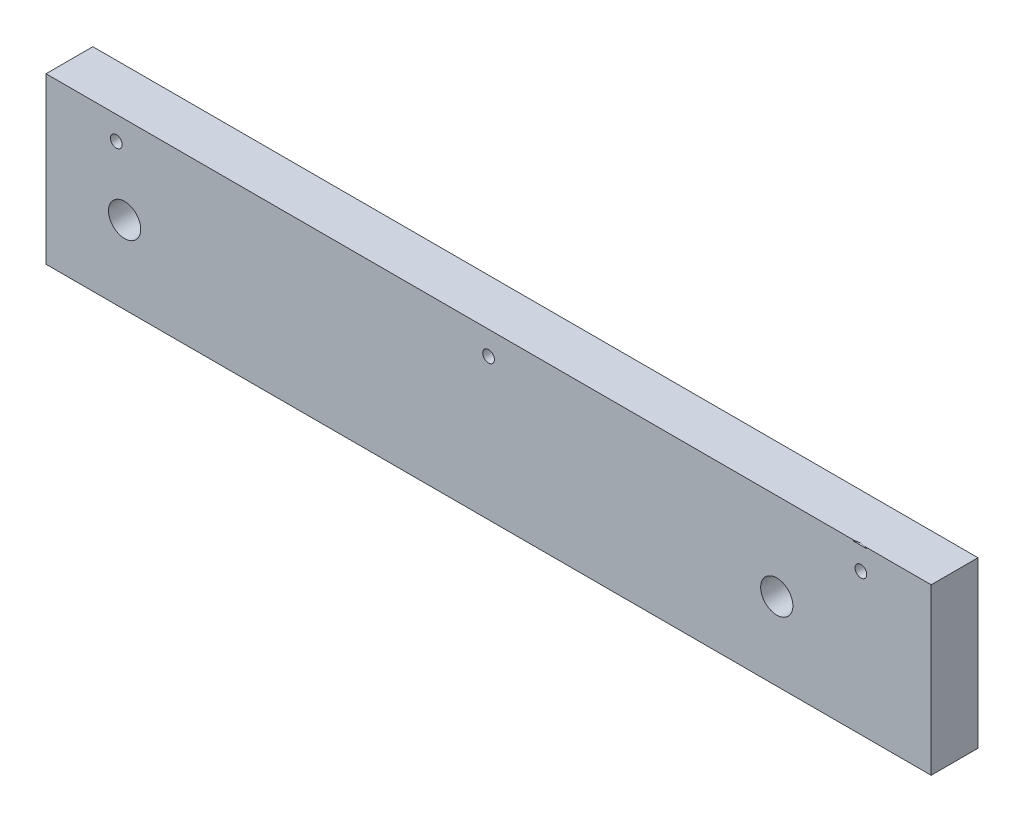
ISO-10303-21;
HEADER;
FILE_DESCRIPTION(('STEP AP214'),'2;1');
FILE_NAME('part.step','',(''),(''),'','','');
FILE_SCHEMA(('AUTOMOTIVE_DESIGN { 1 0 10303 214 1 1 1 1 }'));
ENDSEC;
DATA;
#1=APPLICATION_CONTEXT('core data for automotive mechanical design processes');
#2=APPLICATION_PROTOCOL_DEFINITION('international standard','automotive_design',2000,#1);
#3=PRODUCT_CONTEXT('',#1,'mechanical');
#4=PRODUCT('Part','Part','',(#3));
#5=PRODUCT_RELATED_PRODUCT_CATEGORY('part','',(#4));
#6=PRODUCT_DEFINITION_FORMATION('','',#4);
#7=PRODUCT_DEFINITION_CONTEXT('part definition',#1,'design');
#8=PRODUCT_DEFINITION('design','',#6,#7);
#9=PRODUCT_DEFINITION_SHAPE('','',#8);
#10=(LENGTH_UNIT() NAMED_UNIT(*) SI_UNIT(.MILLI.,.METRE.));
#11=(NAMED_UNIT(*) PLANE_ANGLE_UNIT() SI_UNIT($,.RADIAN.));
#12=(NAMED_UNIT(*) SI_UNIT($,.STERADIAN.) SOLID_ANGLE_UNIT());
#13=UNCERTAINTY_MEASURE_WITH_UNIT(LENGTH_MEASURE(1.E-05),#10,'distance_accuracy_value','');
#14=(GEOMETRIC_REPRESENTATION_CONTEXT(3) GLOBAL_UNCERTAINTY_ASSIGNED_CONTEXT((#13)) GLOBAL_UNIT_ASSIGNED_CONTEXT((#10,
#11,#12)) REPRESENTATION_CONTEXT('',''));
#15=CARTESIAN_POINT('',(0.,0.,0.));
#16=DIRECTION('',(0.,0.,1.));
#17=DIRECTION('',(1.,0.,0.));
#18=AXIS2_PLACEMENT_3D('',#15,#16,#17);
#19=CARTESIAN_POINT('',(248.049945057014,-188.791741375912,12.7));
#20=DIRECTION('',(-1.,0.,0.));
#21=DIRECTION('',(0.,0.,1.));
#22=AXIS2_PLACEMENT_3D('',#19,#20,#21);
#23=PLANE('',#22);
#24=DIRECTION('',(0.,1.,0.));
#25=VECTOR('',#24,1.);
#26=CARTESIAN_POINT('',(248.049945057014,-188.791741375912,0.));
#27=LINE('',#26,#25);
#28=CARTESIAN_POINT('',(248.049945057014,-188.791741375912,0.));
#29=VERTEX_POINT('',#28);
#30=CARTESIAN_POINT('',(248.049945057014,-144.049999994107,0.));
#31=VERTEX_POINT('',#30);
#32=EDGE_CURVE('E118',#29,#31,#27,.T.);
#33=ORIENTED_EDGE('',*,*,#32,.T.);
#34=DIRECTION('',(0.,0.,-1.));
#35=VECTOR('',#34,1.);
#36=CARTESIAN_POINT('',(248.049945057014,-144.049999994107,12.7));
#37=LINE('',#36,#35);
#38=CARTESIAN_POINT('',(248.049945057014,-144.049999994107,12.7));
#39=VERTEX_POINT('',#38);
#40=EDGE_CURVE('E133',#39,#31,#37,.T.);
#41=ORIENTED_EDGE('',*,*,#40,.F.);
#42=DIRECTION('',(0.,1.,0.));
#43=VECTOR('',#42,1.);
#44=CARTESIAN_POINT('',(248.049945057014,-188.791741375912,12.7));
#45=LINE('',#44,#43);
#46=CARTESIAN_POINT('',(248.049945057014,-188.791741375912,12.7));
#47=VERTEX_POINT('',#46);
#48=EDGE_CURVE('E107',#47,#39,#45,.T.);
#49=ORIENTED_EDGE('',*,*,#48,.F.);
#50=DIRECTION('',(0.,0.,-1.));
#51=VECTOR('',#50,1.);
#52=CARTESIAN_POINT('',(248.049945057014,-188.791741375912,12.7));
#53=LINE('',#52,#51);
#54=EDGE_CURVE('E117',#47,#29,#53,.T.);
#55=ORIENTED_EDGE('',*,*,#54,.T.);
#56=EDGE_LOOP('',(#33,#41,#49,#55));
#57=FACE_BOUND('',#56,.T.);
#58=ADVANCED_FACE('F35',(#57),#23,.F.);
#59=CARTESIAN_POINT('',(248.049945057014,-144.049999994107,12.7));
#60=DIRECTION('',(0.,-1.,0.));
#61=DIRECTION('',(1.,0.,0.));
#62=AXIS2_PLACEMENT_3D('',#59,#60,#61);
#63=PLANE('',#62);
#64=DIRECTION('',(-1.,0.,0.));
#65=VECTOR('',#64,1.);
#66=CARTESIAN_POINT('',(248.049945057014,-144.049999994107,12.7));
#67=LINE('',#66,#65);
#68=CARTESIAN_POINT('',(227.310825355161,-144.049999994107,12.7));
#69=VERTEX_POINT('',#68);
#70=CARTESIAN_POINT('',(8.04994505701401,-144.049999994107,12.7));
#71=VERTEX_POINT('',#70);
#72=EDGE_CURVE('E110',#69,#71,#67,.T.);
#73=ORIENTED_EDGE('',*,*,#72,.F.);
#74=CARTESIAN_POINT('',(228.697300634657,-144.049999994107,17.3445448269995));
#75=DIRECTION('',(0.,-1.,0.));
#76=DIRECTION('',(1.,0.,0.));
#77=AXIS2_PLACEMENT_3D('',#74,#75,#76);
#78=CIRCLE('',#77,4.8470723484039);
#79=CARTESIAN_POINT('',(230.083775914153,-144.049999994107,12.7));
#80=VERTEX_POINT('',#79);
#81=EDGE_CURVE('E49',#69,#80,#78,.T.);
#82=ORIENTED_EDGE('',*,*,#81,.T.);
#83=EDGE_CURVE('E86',#39,#80,#67,.T.);
#84=ORIENTED_EDGE('',*,*,#83,.F.);
#85=ORIENTED_EDGE('',*,*,#40,.T.);
#86=DIRECTION('',(-1.,0.,0.));
#87=VECTOR('',#86,1.);
#88=CARTESIAN_POINT('',(248.049945057014,-144.049999994107,0.));
#89=LINE('',#88,#87);
#90=CARTESIAN_POINT('',(8.04994505701401,-144.049999994107,0.));
#91=VERTEX_POINT('',#90);
#92=EDGE_CURVE('E121',#31,#91,#89,.T.);
#93=ORIENTED_EDGE('',*,*,#92,.T.);
#94=DIRECTION('',(0.,0.,-1.));
#95=VECTOR('',#94,1.);
#96=CARTESIAN_POINT('',(8.04994505701401,-144.049999994107,12.7));
#97=LINE('',#96,#95);
#98=EDGE_CURVE('E130',#71,#91,#97,.T.);
#99=ORIENTED_EDGE('',*,*,#98,.F.);
#100=EDGE_LOOP('',(#73,#82,#84,#85,#93,#99));
#101=FACE_BOUND('',#100,.T.);
#102=ADVANCED_FACE('F194',(#101),#63,.F.);
#103=CARTESIAN_POINT('',(8.04994505701401,-188.791741375912,12.7));
#104=DIRECTION('',(1.,0.,0.));
#105=DIRECTION('',(0.,0.,-1.));
#106=AXIS2_PLACEMENT_3D('',#103,#104,#105);
#107=PLANE('',#106);
#108=DIRECTION('',(0.,-1.,0.));
#109=VECTOR('',#108,1.);
#110=CARTESIAN_POINT('',(8.04994505701401,-188.791741375912,0.));
#111=LINE('',#110,#109);
#112=CARTESIAN_POINT('',(8.04994505701401,-188.791741375912,0.));
#113=VERTEX_POINT('',#112);
#114=EDGE_CURVE('E124',#91,#113,#111,.T.);
#115=ORIENTED_EDGE('',*,*,#114,.T.);
#116=DIRECTION('',(0.,0.,-1.));
#117=VECTOR('',#116,1.);
#118=CARTESIAN_POINT('',(8.04994505701401,-188.791741375912,12.7));
#119=LINE('',#118,#117);
#120=CARTESIAN_POINT('',(8.04994505701401,-188.791741375912,12.7));
#121=VERTEX_POINT('',#120);
#122=EDGE_CURVE('E128',#121,#113,#119,.T.);
#123=ORIENTED_EDGE('',*,*,#122,.F.);
#124=DIRECTION('',(0.,-1.,0.));
#125=VECTOR('',#124,1.);
#126=CARTESIAN_POINT('',(8.04994505701401,-188.791741375912,12.7));
#127=LINE('',#126,#125);
#128=EDGE_CURVE('E109',#71,#121,#127,.T.);
#129=ORIENTED_EDGE('',*,*,#128,.F.);
#130=ORIENTED_EDGE('',*,*,#98,.T.);
#131=EDGE_LOOP('',(#115,#123,#129,#130));
#132=FACE_BOUND('',#131,.T.);
#133=ADVANCED_FACE('F200',(#132),#107,.F.);
#134=CARTESIAN_POINT('',(248.049945057014,-188.791741375912,12.7));
#135=DIRECTION('',(0.,1.,0.));
#136=DIRECTION('',(-1.,0.,0.));
#137=AXIS2_PLACEMENT_3D('',#134,#135,#136);
#138=PLANE('',#137);
#139=DIRECTION('',(1.,0.,0.));
#140=VECTOR('',#139,1.);
#141=CARTESIAN_POINT('',(248.049945057014,-188.791741375912,0.));
#142=LINE('',#141,#140);
#143=EDGE_CURVE('E79',#113,#29,#142,.T.);
#144=ORIENTED_EDGE('',*,*,#143,.T.);
#145=ORIENTED_EDGE('',*,*,#54,.F.);
#146=DIRECTION('',(1.,0.,0.));
#147=VECTOR('',#146,1.);
#148=CARTESIAN_POINT('',(248.049945057014,-188.791741375912,12.7));
#149=LINE('',#148,#147);
#150=EDGE_CURVE('E58',#121,#47,#149,.T.);
#151=ORIENTED_EDGE('',*,*,#150,.F.);
#152=ORIENTED_EDGE('',*,*,#122,.T.);
#153=EDGE_LOOP('',(#144,#145,#151,#152));
#154=FACE_BOUND('',#153,.T.);
#155=ADVANCED_FACE('F209',(#154),#138,.F.);
#156=CARTESIAN_POINT('',(0.,0.,12.7));
#157=DIRECTION('',(0.,0.,1.));
#158=DIRECTION('',(1.,0.,0.));
#159=AXIS2_PLACEMENT_3D('',#156,#157,#158);
#160=PLANE('',#159);
#161=CARTESIAN_POINT('',(206.18759999999,-167.735499994106,12.7));
#162=DIRECTION('',(0.,0.,1.));
#163=DIRECTION('',(1.,0.,0.));
#164=AXIS2_PLACEMENT_3D('',#161,#162,#163);
#165=CIRCLE('',#164,4.36498999999999);
#166=CARTESIAN_POINT('',(210.55258999999,-167.735499994106,12.7));
#167=VERTEX_POINT('',#166);
#168=EDGE_CURVE('E274',#167,#167,#165,.T.);
#169=ORIENTED_EDGE('',*,*,#168,.F.);
#170=EDGE_LOOP('',(#169));
#171=FACE_BOUND('',#170,.T.);
#172=CARTESIAN_POINT('',(29.3623999999953,-167.735499994106,12.7));
#173=DIRECTION('',(0.,0.,1.));
#174=DIRECTION('',(1.,0.,0.));
#175=AXIS2_PLACEMENT_3D('',#172,#173,#174);
#176=CIRCLE('',#175,4.36498999999999);
#177=CARTESIAN_POINT('',(33.7273899999953,-167.735499994106,12.7));
#178=VERTEX_POINT('',#177);
#179=EDGE_CURVE('E276',#178,#178,#176,.T.);
#180=ORIENTED_EDGE('',*,*,#179,.F.);
#181=EDGE_LOOP('',(#180));
#182=FACE_BOUND('',#181,.T.);
#183=CARTESIAN_POINT('',(237.981549456091,-150.416272274613,12.7));
#184=CARTESIAN_POINT('',(237.734333604583,-150.161999446377,12.7));
#185=CARTESIAN_POINT('',(237.486157989487,-149.908646255083,12.7));
#186=CARTESIAN_POINT('',(236.987225019521,-149.404404805554,12.7));
#187=CARTESIAN_POINT('',(236.73646719814,-149.153517009313,12.7));
#188=CARTESIAN_POINT('',(236.231531106897,-148.654662273089,12.7));
#189=CARTESIAN_POINT('',(235.977349498629,-148.406698704518,12.7));
#190=CARTESIAN_POINT('',(235.464943697667,-147.915007526449,12.7));
#191=CARTESIAN_POINT('',(235.206719814528,-147.671279595578,12.7));
#192=CARTESIAN_POINT('',(234.741032605528,-147.241337524693,12.7));
#193=CARTESIAN_POINT('',(234.534588648598,-147.054021489424,12.7));
#194=CARTESIAN_POINT('',(234.11759813312,-146.684019558571,12.7));
#195=CARTESIAN_POINT('',(233.907051832772,-146.501333373237,12.7));
#196=CARTESIAN_POINT('',(233.480385282629,-146.141832229095,12.7));
#197=CARTESIAN_POINT('',(233.264256372398,-145.965027503803,12.7));
#198=CARTESIAN_POINT('',(232.825300790409,-145.619937185382,12.7));
#199=CARTESIAN_POINT('',(232.602475489359,-145.45164986747,12.7));
#200=CARTESIAN_POINT('',(232.209750567442,-145.171193075791,12.7));
#201=CARTESIAN_POINT('',(232.041888646103,-145.056183158063,12.7));
#202=CARTESIAN_POINT('',(231.70054374904,-144.83462805843,12.7));
#203=CARTESIAN_POINT('',(231.527059165032,-144.728085329075,12.7));
#204=CARTESIAN_POINT('',(231.173977289326,-144.526623289529,12.7));
#205=CARTESIAN_POINT('',(230.994396422186,-144.431675493742,12.7));
#206=CARTESIAN_POINT('',(230.627946616048,-144.257065000242,12.7));
#207=CARTESIAN_POINT('',(230.441083632753,-144.177390114612,12.7));
#208=CARTESIAN_POINT('',(230.133690072165,-144.065244361273,12.7));
#209=CARTESIAN_POINT('',(230.015471393688,-144.026437675377,12.7));
#210=CARTESIAN_POINT('',(229.776488763881,-143.95774030418,12.7));
#211=CARTESIAN_POINT('',(229.655725890944,-143.927845919559,12.7));
#212=CARTESIAN_POINT('',(229.41244479782,-143.878235387058,12.7));
#213=CARTESIAN_POINT('',(229.289932249643,-143.858491758879,12.7));
#214=CARTESIAN_POINT('',(229.043623092201,-143.829998148841,12.7));
#215=CARTESIAN_POINT('',(228.919826550385,-143.821247592417,12.7));
#216=CARTESIAN_POINT('',(228.671343224647,-143.815182136133,12.7));
#217=CARTESIAN_POINT('',(228.546655046843,-143.817923335933,12.7));
#218=CARTESIAN_POINT('',(228.298063900401,-143.834820662496,12.7));
#219=CARTESIAN_POINT('',(228.174160951794,-143.84897707931,12.7));
#220=CARTESIAN_POINT('',(227.927814470636,-143.888025972753,12.7));
#221=CARTESIAN_POINT('',(227.805374535945,-143.912940860784,12.7));
#222=CARTESIAN_POINT('',(227.562870533186,-143.972394325809,12.7));
#223=CARTESIAN_POINT('',(227.442806847623,-144.006934438898,12.7));
#224=CARTESIAN_POINT('',(227.138374964884,-144.106226007137,12.7));
#225=CARTESIAN_POINT('',(226.955978682858,-144.177023688187,12.7));
#226=CARTESIAN_POINT('',(226.598096452413,-144.334305469288,12.7));
#227=CARTESIAN_POINT('',(226.422615979314,-144.420801706004,12.7));
#228=CARTESIAN_POINT('',(226.076274616841,-144.60651181566,12.7));
#229=CARTESIAN_POINT('',(225.905479087802,-144.7058463875,12.7));
#230=CARTESIAN_POINT('',(225.653566410102,-144.8615916311,12.7));
#231=CARTESIAN_POINT('',(225.570322031031,-144.914621516046,12.7));
#232=CARTESIAN_POINT('',(225.405125535314,-145.022658041816,12.7));
#233=CARTESIAN_POINT('',(225.323173400561,-145.077664654906,12.7));
#234=CARTESIAN_POINT('',(225.101333315836,-145.229991934979,12.7));
#235=CARTESIAN_POINT('',(224.962615888852,-145.329017228409,12.7));
#236=CARTESIAN_POINT('',(224.688189457154,-145.531164282081,12.7));
#237=CARTESIAN_POINT('',(224.552480833736,-145.634286556949,12.7));
#238=CARTESIAN_POINT('',(224.283587032026,-145.843883885128,12.7));
#239=CARTESIAN_POINT('',(224.150403006564,-145.950360413731,12.7));
#240=CARTESIAN_POINT('',(223.886247900549,-146.166028530439,12.7));
#241=CARTESIAN_POINT('',(223.755276926889,-146.275220249065,12.7));
#242=CARTESIAN_POINT('',(223.364562494062,-146.606686264298,12.7));
#243=CARTESIAN_POINT('',(223.107677502061,-146.832329419263,12.7));
#244=CARTESIAN_POINT('',(222.599583446058,-147.289916564954,12.7));
#245=CARTESIAN_POINT('',(222.348374894695,-147.521861120626,12.7));
#246=CARTESIAN_POINT('',(221.984256856325,-147.864385437734,12.7));
#247=CARTESIAN_POINT('',(221.86962991466,-147.9731471933,12.7));
#248=CARTESIAN_POINT('',(221.641214074637,-148.191536281833,12.7));
#249=CARTESIAN_POINT('',(221.527425135877,-148.301163572536,12.7));
#250=CARTESIAN_POINT('',(221.187146477036,-148.631209590136,12.7));
#251=CARTESIAN_POINT('',(220.961766110968,-148.852772449346,12.7));
#252=CARTESIAN_POINT('',(220.514730974973,-149.296939371842,12.7));
#253=CARTESIAN_POINT('',(220.293061938784,-149.51952911535,12.7));
#254=CARTESIAN_POINT('',(219.851691414398,-149.96659148151,12.7));
#255=CARTESIAN_POINT('',(219.631989659247,-150.191063840439,12.7));
#256=CARTESIAN_POINT('',(219.413051813222,-150.416272274613,12.7));
#257=B_SPLINE_CURVE_WITH_KNOTS('',3,(#183,#184,#185,#186,#187,#188,#189,#190,#191,#192,#193,
#194,#195,#196,#197,#198,#199,#200,#201,#202,#203,#204,#205,#206,#207,#208,#209,#210,#211,#212,
#213,#214,#215,#216,#217,#218,#219,#220,#221,#222,#223,#224,#225,#226,#227,#228,#229,#230,#231,
#232,#233,#234,#235,#236,#237,#238,#239,#240,#241,#242,#243,#244,#245,#246,#247,#248,#249,#250,
#251,#252,#253,#254,#255,#256),.UNSPECIFIED.,.F.,.F.,(4,2,2,2,2,2,2,2,2,2,2,2,2,2,2,2,2,2,2,2,2,
2,2,2,2,2,2,2,2,2,2,2,2,2,2,2,4),(0.,1.06393565358197,2.12806701728832,3.19332432828275,
4.25850045841217,5.09472576828946,5.93089861512546,6.76845742688677,7.60584594800522,
8.21610428579634,8.82653874755658,9.43544200729633,10.0438573153655,10.4168449808006,
10.7896776101744,11.1614955144263,11.5332939843695,11.9069095824919,12.2805346742117,
12.6549418627431,13.029408837321,13.6153269838794,14.2017000525598,14.794052953097,
15.0901339379952,15.3862107705539,15.8974182726379,16.4086901924213,16.9201902125482,
17.4317148686137,18.4572870257012,19.4829514349425,19.9569900093275,20.4310055775795,
21.3791241611997,22.3215293972905,23.2638047527849),.UNSPECIFIED.);
#258=CARTESIAN_POINT('',(230.75511582315,-144.317952605671,12.7));
#259=VERTEX_POINT('',#258);
#260=EDGE_CURVE('E11',#259,#80,#257,.T.);
#261=ORIENTED_EDGE('',*,*,#260,.F.);
#262=DIRECTION('',(1.,0.,0.));
#263=VECTOR('',#262,1.);
#264=CARTESIAN_POINT('',(0.,-144.317952605671,12.7));
#265=LINE('',#264,#263);
#266=CARTESIAN_POINT('',(226.639485446164,-144.317952605671,12.7));
#267=VERTEX_POINT('',#266);
#268=EDGE_CURVE('E38',#267,#259,#265,.T.);
#269=ORIENTED_EDGE('',*,*,#268,.F.);
#270=EDGE_CURVE('E43',#69,#267,#257,.T.);
#271=ORIENTED_EDGE('',*,*,#270,.F.);
#272=ORIENTED_EDGE('',*,*,#72,.T.);
#273=ORIENTED_EDGE('',*,*,#128,.T.);
#274=ORIENTED_EDGE('',*,*,#150,.T.);
#275=ORIENTED_EDGE('',*,*,#48,.T.);
#276=ORIENTED_EDGE('',*,*,#83,.T.);
#277=EDGE_LOOP('',(#261,#269,#271,#272,#273,#274,#275,#276));
#278=FACE_BOUND('',#277,.T.);
#279=CARTESIAN_POINT('',(228.999945057012,-150.399999994106,12.7));
#280=DIRECTION('',(0.,0.,1.));
#281=DIRECTION('',(1.,0.,0.));
#282=AXIS2_PLACEMENT_3D('',#279,#280,#281);
#283=CIRCLE('',#282,1.58749999999999);
#284=CARTESIAN_POINT('',(230.587445057012,-150.399999994106,12.7));
#285=VERTEX_POINT('',#284);
#286=EDGE_CURVE('E143',#285,#285,#283,.T.);
#287=ORIENTED_EDGE('',*,*,#286,.F.);
#288=EDGE_LOOP('',(#287));
#289=FACE_BOUND('',#288,.T.);
#290=CARTESIAN_POINT('',(128.049945057012,-150.399999994106,12.7));
#291=DIRECTION('',(0.,0.,1.));
#292=DIRECTION('',(1.,0.,0.));
#293=AXIS2_PLACEMENT_3D('',#290,#291,#292);
#294=CIRCLE('',#293,1.58749999999999);
#295=CARTESIAN_POINT('',(129.637445057012,-150.399999994106,12.7));
#296=VERTEX_POINT('',#295);
#297=EDGE_CURVE('E138',#296,#296,#294,.T.);
#298=ORIENTED_EDGE('',*,*,#297,.F.);
#299=EDGE_LOOP('',(#298));
#300=FACE_BOUND('',#299,.T.);
#301=CARTESIAN_POINT('',(27.0999450570117,-150.399999994106,12.7));
#302=DIRECTION('',(0.,0.,1.));
#303=DIRECTION('',(1.,0.,0.));
#304=AXIS2_PLACEMENT_3D('',#301,#302,#303);
#305=CIRCLE('',#304,1.5875);
#306=CARTESIAN_POINT('',(28.6874450570117,-150.399999994106,12.7));
#307=VERTEX_POINT('',#306);
#308=EDGE_CURVE('E122',#307,#307,#305,.T.);
#309=ORIENTED_EDGE('',*,*,#308,.F.);
#310=EDGE_LOOP('',(#309));
#311=FACE_BOUND('',#310,.T.);
#312=ADVANCED_FACE('F104',(#171,#182,#278,#289,#300,#311),#160,.T.);
#313=CARTESIAN_POINT('',(0.,0.,0.));
#314=DIRECTION('',(0.,0.,1.));
#315=DIRECTION('',(1.,0.,0.));
#316=AXIS2_PLACEMENT_3D('',#313,#314,#315);
#317=PLANE('',#316);
#318=CARTESIAN_POINT('',(206.18759999999,-167.735499994106,0.));
#319=DIRECTION('',(0.,0.,1.));
#320=DIRECTION('',(1.,0.,0.));
#321=AXIS2_PLACEMENT_3D('',#318,#319,#320);
#322=CIRCLE('',#321,4.36498999999999);
#323=CARTESIAN_POINT('',(210.55258999999,-167.735499994106,0.));
#324=VERTEX_POINT('',#323);
#325=EDGE_CURVE('E271',#324,#324,#322,.T.);
#326=ORIENTED_EDGE('',*,*,#325,.T.);
#327=EDGE_LOOP('',(#326));
#328=FACE_BOUND('',#327,.T.);
#329=CARTESIAN_POINT('',(29.3623999999953,-167.735499994106,0.));
#330=DIRECTION('',(0.,0.,1.));
#331=DIRECTION('',(1.,0.,0.));
#332=AXIS2_PLACEMENT_3D('',#329,#330,#331);
#333=CIRCLE('',#332,4.36499);
#334=CARTESIAN_POINT('',(33.7273899999953,-167.735499994106,0.));
#335=VERTEX_POINT('',#334);
#336=EDGE_CURVE('E102',#335,#335,#333,.T.);
#337=ORIENTED_EDGE('',*,*,#336,.T.);
#338=EDGE_LOOP('',(#337));
#339=FACE_BOUND('',#338,.T.);
#340=CARTESIAN_POINT('',(228.999945057012,-150.399999994106,2.20309881449055E-13));
#341=DIRECTION('',(0.,0.,-1.));
#342=DIRECTION('',(-1.,0.,0.));
#343=AXIS2_PLACEMENT_3D('',#340,#341,#342);
#344=CIRCLE('',#343,5.08);
#345=CARTESIAN_POINT('',(223.919945057012,-150.399999994106,2.20309881454085E-13));
#346=VERTEX_POINT('',#345);
#347=EDGE_CURVE('E284',#346,#346,#344,.T.);
#348=ORIENTED_EDGE('',*,*,#347,.F.);
#349=EDGE_LOOP('',(#348));
#350=FACE_BOUND('',#349,.T.);
#351=CARTESIAN_POINT('',(128.049945057012,-150.399999994106,2.20309881449055E-13));
#352=DIRECTION('',(0.,0.,-1.));
#353=DIRECTION('',(-1.,0.,0.));
#354=AXIS2_PLACEMENT_3D('',#351,#352,#353);
#355=CIRCLE('',#354,5.08);
#356=CARTESIAN_POINT('',(122.969945057012,-150.399999994106,2.20309881454085E-13));
#357=VERTEX_POINT('',#356);
#358=EDGE_CURVE('E145',#357,#357,#355,.T.);
#359=ORIENTED_EDGE('',*,*,#358,.F.);
#360=EDGE_LOOP('',(#359));
#361=FACE_BOUND('',#360,.T.);
#362=CARTESIAN_POINT('',(27.0999450570117,-150.399999994106,2.20309881449055E-13));
#363=DIRECTION('',(0.,0.,-1.));
#364=DIRECTION('',(-1.,0.,0.));
#365=AXIS2_PLACEMENT_3D('',#362,#363,#364);
#366=CIRCLE('',#365,5.08);
#367=CARTESIAN_POINT('',(22.0199450570117,-150.399999994106,2.20309881460913E-13));
#368=VERTEX_POINT('',#367);
#369=EDGE_CURVE('E141',#368,#368,#366,.T.);
#370=ORIENTED_EDGE('',*,*,#369,.F.);
#371=EDGE_LOOP('',(#370));
#372=FACE_BOUND('',#371,.T.);
#373=ORIENTED_EDGE('',*,*,#32,.F.);
#374=ORIENTED_EDGE('',*,*,#143,.F.);
#375=ORIENTED_EDGE('',*,*,#114,.F.);
#376=ORIENTED_EDGE('',*,*,#92,.F.);
#377=EDGE_LOOP('',(#373,#374,#375,#376));
#378=FACE_BOUND('',#377,.T.);
#379=ADVANCED_FACE('F185',(#328,#339,#350,#361,#372,#378),#317,.F.);
#380=CARTESIAN_POINT('',(27.0999450570117,-150.399999994106,2.22044604925031E-13));
#381=DIRECTION('',(0.,0.,-1.));
#382=DIRECTION('',(-1.,0.,0.));
#383=AXIS2_PLACEMENT_3D('',#380,#381,#382);
#384=CYLINDRICAL_SURFACE('',#383,1.5875);
#385=ORIENTED_EDGE('',*,*,#308,.T.);
#386=EDGE_LOOP('',(#385));
#387=FACE_BOUND('',#386,.T.);
#388=CARTESIAN_POINT('',(27.0999450570117,-150.399999994106,4.01766166221958));
#389=DIRECTION('',(0.,0.,-1.));
#390=DIRECTION('',(-1.,0.,0.));
#391=AXIS2_PLACEMENT_3D('',#388,#389,#390);
#392=CIRCLE('',#391,1.5875);
#393=CARTESIAN_POINT('',(25.5124450570117,-150.399999994106,4.01766166221958));
#394=VERTEX_POINT('',#393);
#395=EDGE_CURVE('E137',#394,#394,#392,.T.);
#396=ORIENTED_EDGE('',*,*,#395,.T.);
#397=EDGE_LOOP('',(#396));
#398=FACE_BOUND('',#397,.T.);
#399=ADVANCED_FACE('F182',(#387,#398),#384,.F.);
#400=CARTESIAN_POINT('',(27.0999450570117,-150.399999994106,2.20309881449055E-13));
#401=DIRECTION('',(0.,0.,-1.));
#402=DIRECTION('',(-1.,0.,0.));
#403=AXIS2_PLACEMENT_3D('',#400,#401,#402);
#404=CONICAL_SURFACE('',#403,5.08,0.715584993317677);
#405=CARTESIAN_POINT('',(25.5124450570117,-150.399999994106,4.01766166221958));
#406=CARTESIAN_POINT('',(25.4760648486784,-150.399999994106,3.97581101990479));
#407=CARTESIAN_POINT('',(25.4396846403451,-150.399999994106,3.93396037759001));
#408=CARTESIAN_POINT('',(25.3669242236784,-150.399999994106,3.85025909296044));
#409=CARTESIAN_POINT('',(25.3305440153451,-150.399999994106,3.80840845064565));
#410=CARTESIAN_POINT('',(25.2577835986784,-150.399999994106,3.72470716601608));
#411=CARTESIAN_POINT('',(25.2214033903451,-150.399999994106,3.6828565237013));
#412=CARTESIAN_POINT('',(25.1486429736784,-150.399999994106,3.59915523907173));
#413=CARTESIAN_POINT('',(25.1122627653451,-150.399999994106,3.55730459675694));
#414=CARTESIAN_POINT('',(25.0395023486784,-150.399999994106,3.47360331212737));
#415=CARTESIAN_POINT('',(25.0031221403451,-150.399999994106,3.43175266981259));
#416=CARTESIAN_POINT('',(24.9303617236784,-150.399999994106,3.34805138518302));
#417=CARTESIAN_POINT('',(24.8939815153451,-150.399999994106,3.30620074286823));
#418=CARTESIAN_POINT('',(24.8212210986784,-150.399999994106,3.22249945823866));
#419=CARTESIAN_POINT('',(24.7848408903451,-150.399999994106,3.18064881592388));
#420=CARTESIAN_POINT('',(24.7120804736784,-150.399999994106,3.09694753129431));
#421=CARTESIAN_POINT('',(24.6757002653451,-150.399999994106,3.05509688897952));
#422=CARTESIAN_POINT('',(24.6029398486784,-150.399999994106,2.97139560434995));
#423=CARTESIAN_POINT('',(24.5665596403451,-150.399999994106,2.92954496203517));
#424=CARTESIAN_POINT('',(24.4937992236784,-150.399999994106,2.8458436774056));
#425=CARTESIAN_POINT('',(24.4574190153451,-150.399999994106,2.80399303509081));
#426=CARTESIAN_POINT('',(24.3846585986784,-150.399999994106,2.72029175046124));
#427=CARTESIAN_POINT('',(24.3482783903451,-150.399999994106,2.67844110814646));
#428=CARTESIAN_POINT('',(24.2755179736784,-150.399999994106,2.59473982351689));
#429=CARTESIAN_POINT('',(24.2391377653451,-150.399999994106,2.5528891812021));
#430=CARTESIAN_POINT('',(24.1663773486784,-150.399999994106,2.46918789657253));
#431=CARTESIAN_POINT('',(24.1299971403451,-150.399999994106,2.42733725425775));
#432=CARTESIAN_POINT('',(24.0572367236784,-150.399999994106,2.34363596962818));
#433=CARTESIAN_POINT('',(24.0208565153451,-150.399999994106,2.30178532731339));
#434=CARTESIAN_POINT('',(23.9480960986784,-150.399999994106,2.21808404268382));
#435=CARTESIAN_POINT('',(23.9117158903451,-150.399999994106,2.17623340036904));
#436=CARTESIAN_POINT('',(23.8389554736784,-150.399999994106,2.09253211573947));
#437=CARTESIAN_POINT('',(23.8025752653451,-150.399999994106,2.05068147342468));
#438=CARTESIAN_POINT('',(23.7298148486784,-150.399999994106,1.96698018879511));
#439=CARTESIAN_POINT('',(23.6934346403451,-150.399999994106,1.92512954648033));
#440=CARTESIAN_POINT('',(23.6206742236784,-150.399999994106,1.84142826185076));
#441=CARTESIAN_POINT('',(23.5842940153451,-150.399999994106,1.79957761953597));
#442=CARTESIAN_POINT('',(23.5115335986784,-150.399999994106,1.7158763349064));
#443=CARTESIAN_POINT('',(23.4751533903451,-150.399999994106,1.67402569259162));
#444=CARTESIAN_POINT('',(23.4023929736784,-150.399999994106,1.59032440796205));
#445=CARTESIAN_POINT('',(23.3660127653451,-150.399999994106,1.54847376564726));
#446=CARTESIAN_POINT('',(23.2932523486784,-150.399999994106,1.46477248101769));
#447=CARTESIAN_POINT('',(23.2568721403451,-150.399999994106,1.42292183870291));
#448=CARTESIAN_POINT('',(23.1841117236784,-150.399999994106,1.33922055407334));
#449=CARTESIAN_POINT('',(23.1477315153451,-150.399999994106,1.29736991175855));
#450=CARTESIAN_POINT('',(23.0749710986784,-150.399999994106,1.21366862712898));
#451=CARTESIAN_POINT('',(23.0385908903451,-150.399999994106,1.1718179848142));
#452=CARTESIAN_POINT('',(22.9658304736784,-150.399999994106,1.08811670018463));
#453=CARTESIAN_POINT('',(22.9294502653451,-150.399999994106,1.04626605786984));
#454=CARTESIAN_POINT('',(22.8566898486784,-150.399999994106,0.962564773240274));
#455=CARTESIAN_POINT('',(22.8203096403451,-150.399999994106,0.92071413092549));
#456=CARTESIAN_POINT('',(22.7475492236784,-150.399999994106,0.83701284629592));
#457=CARTESIAN_POINT('',(22.7111690153451,-150.399999994106,0.795162203981134));
#458=CARTESIAN_POINT('',(22.6384085986784,-150.399999994106,0.711460919351564));
#459=CARTESIAN_POINT('',(22.6020283903451,-150.399999994106,0.66961027703678));
#460=CARTESIAN_POINT('',(22.5292679736784,-150.399999994106,0.58590899240721));
#461=CARTESIAN_POINT('',(22.4928877653451,-150.399999994106,0.544058350092425));
#462=CARTESIAN_POINT('',(22.4201273486784,-150.399999994106,0.460357065462854));
#463=CARTESIAN_POINT('',(22.3837471403451,-150.399999994106,0.41850642314807));
#464=CARTESIAN_POINT('',(22.3109867236784,-150.399999994106,0.3348051385185));
#465=CARTESIAN_POINT('',(22.2746065153451,-150.399999994106,0.292954496203715));
#466=CARTESIAN_POINT('',(22.2018460986784,-150.399999994106,0.209253211574145));
#467=CARTESIAN_POINT('',(22.1654658903451,-150.399999994106,0.16740256925936));
#468=CARTESIAN_POINT('',(22.0927054736784,-150.399999994106,0.0837012846297902));
#469=CARTESIAN_POINT('',(22.0563252653451,-150.399999994106,0.0418506423150054));
#470=CARTESIAN_POINT('',(22.0199450570117,-150.399999994106,2.20309881449055E-13));
#471=B_SPLINE_CURVE_WITH_KNOTS('',3,(#405,#406,#407,#408,#409,#410,#411,#412,#413,#414,#415,
#416,#417,#418,#419,#420,#421,#422,#423,#424,#425,#426,#427,#428,#429,#430,#431,#432,#433,#434,
#435,#436,#437,#438,#439,#440,#441,#442,#443,#444,#445,#446,#447,#448,#449,#450,#451,#452,#453,
#454,#455,#456,#457,#458,#459,#460,#461,#462,#463,#464,#465,#466,#467,#468,#469,#470),
.UNSPECIFIED.,.F.,.F.,(4,2,2,2,2,2,2,2,2,2,2,2,2,2,2,2,2,2,2,2,2,2,2,2,2,2,2,2,2,2,2,2,4),(0.,
0.166357934541251,0.332715869082503,0.499073803623754,0.665431738165003,0.831789672706258,
0.998147607247507,1.16450554178876,1.33086347633001,1.49722141087126,1.66357934541251,
1.82993727995376,1.99629521449502,2.16265314903627,2.32901108357752,2.49536901811877,
2.66172695266002,2.82808488720127,2.99444282174252,3.16080075628377,3.32715869082503,
3.49351662536628,3.65987455990753,3.82623249444878,3.99259042899003,4.15894836353128,
4.32530629807253,4.49166423261379,4.65802216715504,4.82438010169629,4.99073803623754,
5.15709597077879,5.32345390532004),.UNSPECIFIED.);
#472=EDGE_CURVE('BSEAM179',#394,#368,#471,.T.);
#473=ORIENTED_EDGE('',*,*,#395,.F.);
#474=ORIENTED_EDGE('',*,*,#369,.T.);
#475=ORIENTED_EDGE('',*,*,#472,.T.);
#476=ORIENTED_EDGE('',*,*,#472,.F.);
#477=EDGE_LOOP('',(#473,#475,#474,#476));
#478=FACE_BOUND('',#477,.T.);
#479=ADVANCED_FACE('F179',(#478),#404,.F.);
#480=CARTESIAN_POINT('',(128.049945057012,-150.399999994106,2.22044604925031E-13));
#481=DIRECTION('',(0.,0.,-1.));
#482=DIRECTION('',(-1.,0.,0.));
#483=AXIS2_PLACEMENT_3D('',#480,#481,#482);
#484=CYLINDRICAL_SURFACE('',#483,1.58749999999999);
#485=ORIENTED_EDGE('',*,*,#297,.T.);
#486=EDGE_LOOP('',(#485));
#487=FACE_BOUND('',#486,.T.);
#488=CARTESIAN_POINT('',(128.049945057012,-150.399999994106,4.01766166221958));
#489=DIRECTION('',(0.,0.,-1.));
#490=DIRECTION('',(-1.,0.,0.));
#491=AXIS2_PLACEMENT_3D('',#488,#489,#490);
#492=CIRCLE('',#491,1.58749999999999);
#493=CARTESIAN_POINT('',(126.462445057012,-150.399999994106,4.01766166221958));
#494=VERTEX_POINT('',#493);
#495=EDGE_CURVE('E142',#494,#494,#492,.T.);
#496=ORIENTED_EDGE('',*,*,#495,.T.);
#497=EDGE_LOOP('',(#496));
#498=FACE_BOUND('',#497,.T.);
#499=ADVANCED_FACE('F175',(#487,#498),#484,.F.);
#500=CARTESIAN_POINT('',(128.049945057012,-150.399999994106,2.20309881449055E-13));
#501=DIRECTION('',(0.,0.,-1.));
#502=DIRECTION('',(-1.,0.,0.));
#503=AXIS2_PLACEMENT_3D('',#500,#501,#502);
#504=CONICAL_SURFACE('',#503,5.08,0.715584993317679);
#505=CARTESIAN_POINT('',(126.462445057012,-150.399999994106,4.01766166221958));
#506=CARTESIAN_POINT('',(126.426064848679,-150.399999994106,3.97581101990479));
#507=CARTESIAN_POINT('',(126.389684640345,-150.399999994106,3.93396037759001));
#508=CARTESIAN_POINT('',(126.316924223679,-150.399999994106,3.85025909296044));
#509=CARTESIAN_POINT('',(126.280544015345,-150.399999994106,3.80840845064565));
#510=CARTESIAN_POINT('',(126.207783598679,-150.399999994106,3.72470716601608));
#511=CARTESIAN_POINT('',(126.171403390345,-150.399999994106,3.6828565237013));
#512=CARTESIAN_POINT('',(126.098642973679,-150.399999994106,3.59915523907173));
#513=CARTESIAN_POINT('',(126.062262765345,-150.399999994106,3.55730459675694));
#514=CARTESIAN_POINT('',(125.989502348679,-150.399999994106,3.47360331212737));
#515=CARTESIAN_POINT('',(125.953122140345,-150.399999994106,3.43175266981259));
#516=CARTESIAN_POINT('',(125.880361723679,-150.399999994106,3.34805138518302));
#517=CARTESIAN_POINT('',(125.843981515345,-150.399999994106,3.30620074286823));
#518=CARTESIAN_POINT('',(125.771221098679,-150.399999994106,3.22249945823866));
#519=CARTESIAN_POINT('',(125.734840890345,-150.399999994106,3.18064881592388));
#520=CARTESIAN_POINT('',(125.662080473679,-150.399999994106,3.09694753129431));
#521=CARTESIAN_POINT('',(125.625700265345,-150.399999994106,3.05509688897952));
#522=CARTESIAN_POINT('',(125.552939848679,-150.399999994106,2.97139560434995));
#523=CARTESIAN_POINT('',(125.516559640345,-150.399999994106,2.92954496203517));
#524=CARTESIAN_POINT('',(125.443799223679,-150.399999994106,2.8458436774056));
#525=CARTESIAN_POINT('',(125.407419015345,-150.399999994106,2.80399303509081));
#526=CARTESIAN_POINT('',(125.334658598679,-150.399999994106,2.72029175046124));
#527=CARTESIAN_POINT('',(125.298278390345,-150.399999994106,2.67844110814646));
#528=CARTESIAN_POINT('',(125.225517973679,-150.399999994106,2.59473982351689));
#529=CARTESIAN_POINT('',(125.189137765345,-150.399999994106,2.5528891812021));
#530=CARTESIAN_POINT('',(125.116377348679,-150.399999994106,2.46918789657253));
#531=CARTESIAN_POINT('',(125.079997140345,-150.399999994106,2.42733725425775));
#532=CARTESIAN_POINT('',(125.007236723679,-150.399999994106,2.34363596962818));
#533=CARTESIAN_POINT('',(124.970856515345,-150.399999994106,2.30178532731339));
#534=CARTESIAN_POINT('',(124.898096098679,-150.399999994106,2.21808404268382));
#535=CARTESIAN_POINT('',(124.861715890345,-150.399999994106,2.17623340036904));
#536=CARTESIAN_POINT('',(124.788955473679,-150.399999994106,2.09253211573947));
#537=CARTESIAN_POINT('',(124.752575265345,-150.399999994106,2.05068147342468));
#538=CARTESIAN_POINT('',(124.679814848679,-150.399999994106,1.96698018879511));
#539=CARTESIAN_POINT('',(124.643434640345,-150.399999994106,1.92512954648033));
#540=CARTESIAN_POINT('',(124.570674223679,-150.399999994106,1.84142826185076));
#541=CARTESIAN_POINT('',(124.534294015345,-150.399999994106,1.79957761953597));
#542=CARTESIAN_POINT('',(124.461533598679,-150.399999994106,1.7158763349064));
#543=CARTESIAN_POINT('',(124.425153390345,-150.399999994106,1.67402569259162));
#544=CARTESIAN_POINT('',(124.352392973679,-150.399999994106,1.59032440796205));
#545=CARTESIAN_POINT('',(124.316012765345,-150.399999994106,1.54847376564726));
#546=CARTESIAN_POINT('',(124.243252348678,-150.399999994106,1.46477248101769));
#547=CARTESIAN_POINT('',(124.206872140345,-150.399999994106,1.42292183870291));
#548=CARTESIAN_POINT('',(124.134111723679,-150.399999994106,1.33922055407334));
#549=CARTESIAN_POINT('',(124.097731515345,-150.399999994106,1.29736991175855));
#550=CARTESIAN_POINT('',(124.024971098679,-150.399999994106,1.21366862712898));
#551=CARTESIAN_POINT('',(123.988590890345,-150.399999994106,1.1718179848142));
#552=CARTESIAN_POINT('',(123.915830473678,-150.399999994106,1.08811670018463));
#553=CARTESIAN_POINT('',(123.879450265345,-150.399999994106,1.04626605786984));
#554=CARTESIAN_POINT('',(123.806689848679,-150.399999994106,0.962564773240274));
#555=CARTESIAN_POINT('',(123.770309640345,-150.399999994106,0.920714130925489));
#556=CARTESIAN_POINT('',(123.697549223678,-150.399999994106,0.83701284629592));
#557=CARTESIAN_POINT('',(123.661169015345,-150.399999994106,0.795162203981136));
#558=CARTESIAN_POINT('',(123.588408598679,-150.399999994106,0.711460919351566));
#559=CARTESIAN_POINT('',(123.552028390345,-150.399999994106,0.669610277036779));
#560=CARTESIAN_POINT('',(123.479267973679,-150.399999994106,0.585908992407208));
#561=CARTESIAN_POINT('',(123.442887765345,-150.399999994106,0.544058350092424));
#562=CARTESIAN_POINT('',(123.370127348678,-150.399999994106,0.460357065462855));
#563=CARTESIAN_POINT('',(123.333747140345,-150.399999994106,0.418506423148071));
#564=CARTESIAN_POINT('',(123.260986723679,-150.399999994106,0.334805138518501));
#565=CARTESIAN_POINT('',(123.224606515345,-150.399999994106,0.292954496203714));
#566=CARTESIAN_POINT('',(123.151846098679,-150.399999994106,0.209253211574144));
#567=CARTESIAN_POINT('',(123.115465890345,-150.399999994106,0.167402569259359));
#568=CARTESIAN_POINT('',(123.042705473678,-150.399999994106,0.083701284629791));
#569=CARTESIAN_POINT('',(123.006325265345,-150.399999994106,0.0418506423150068));
#570=CARTESIAN_POINT('',(122.969945057012,-150.399999994106,2.20309881449055E-13));
#571=B_SPLINE_CURVE_WITH_KNOTS('',3,(#505,#506,#507,#508,#509,#510,#511,#512,#513,#514,#515,
#516,#517,#518,#519,#520,#521,#522,#523,#524,#525,#526,#527,#528,#529,#530,#531,#532,#533,#534,
#535,#536,#537,#538,#539,#540,#541,#542,#543,#544,#545,#546,#547,#548,#549,#550,#551,#552,#553,
#554,#555,#556,#557,#558,#559,#560,#561,#562,#563,#564,#565,#566,#567,#568,#569,#570),
.UNSPECIFIED.,.F.,.F.,(4,2,2,2,2,2,2,2,2,2,2,2,2,2,2,2,2,2,2,2,2,2,2,2,2,2,2,2,2,2,2,2,4),(0.,
0.166357934541254,0.332715869082507,0.499073803623761,0.665431738164997,0.831789672706251,
0.998147607247505,1.16450554178876,1.33086347633001,1.49722141087127,1.66357934541252,
1.82993727995377,1.99629521449501,2.16265314903626,2.32901108357752,2.49536901811877,
2.66172695266002,2.82808488720128,2.99444282174252,3.16080075628377,3.32715869082503,
3.49351662536628,3.65987455990753,3.82623249444878,3.99259042899003,4.15894836353129,
4.32530629807254,4.49166423261379,4.65802216715504,4.8243801016963,4.99073803623754,
5.15709597077879,5.32345390532005),.UNSPECIFIED.);
#572=EDGE_CURVE('BSEAM171',#494,#357,#571,.T.);
#573=ORIENTED_EDGE('',*,*,#495,.F.);
#574=ORIENTED_EDGE('',*,*,#358,.T.);
#575=ORIENTED_EDGE('',*,*,#572,.T.);
#576=ORIENTED_EDGE('',*,*,#572,.F.);
#577=EDGE_LOOP('',(#573,#575,#574,#576));
#578=FACE_BOUND('',#577,.T.);
#579=ADVANCED_FACE('F171',(#578),#504,.F.);
#580=CARTESIAN_POINT('',(228.999945057012,-150.399999994106,2.22044604925031E-13));
#581=DIRECTION('',(0.,0.,-1.));
#582=DIRECTION('',(-1.,0.,0.));
#583=AXIS2_PLACEMENT_3D('',#580,#581,#582);
#584=CYLINDRICAL_SURFACE('',#583,1.58749999999999);
#585=ORIENTED_EDGE('',*,*,#286,.T.);
#586=EDGE_LOOP('',(#585));
#587=FACE_BOUND('',#586,.T.);
#588=CARTESIAN_POINT('',(228.999945057012,-150.399999994106,4.01766166221958));
#589=DIRECTION('',(0.,0.,-1.));
#590=DIRECTION('',(-1.,0.,0.));
#591=AXIS2_PLACEMENT_3D('',#588,#589,#590);
#592=CIRCLE('',#591,1.58749999999999);
#593=CARTESIAN_POINT('',(227.412445057012,-150.399999994106,4.01766166221958));
#594=VERTEX_POINT('',#593);
#595=EDGE_CURVE('E146',#594,#594,#592,.T.);
#596=ORIENTED_EDGE('',*,*,#595,.T.);
#597=EDGE_LOOP('',(#596));
#598=FACE_BOUND('',#597,.T.);
#599=ADVANCED_FACE('F167',(#587,#598),#584,.F.);
#600=CARTESIAN_POINT('',(228.999945057012,-150.399999994106,2.20309881449055E-13));
#601=DIRECTION('',(0.,0.,-1.));
#602=DIRECTION('',(-1.,0.,0.));
#603=AXIS2_PLACEMENT_3D('',#600,#601,#602);
#604=CONICAL_SURFACE('',#603,5.08,0.715584993317679);
#605=CARTESIAN_POINT('',(227.412445057012,-150.399999994106,4.01766166221958));
#606=CARTESIAN_POINT('',(227.376064848678,-150.399999994106,3.97581101990479));
#607=CARTESIAN_POINT('',(227.339684640345,-150.399999994106,3.93396037759001));
#608=CARTESIAN_POINT('',(227.266924223678,-150.399999994106,3.85025909296044));
#609=CARTESIAN_POINT('',(227.230544015345,-150.399999994106,3.80840845064565));
#610=CARTESIAN_POINT('',(227.157783598678,-150.399999994106,3.72470716601608));
#611=CARTESIAN_POINT('',(227.121403390345,-150.399999994106,3.6828565237013));
#612=CARTESIAN_POINT('',(227.048642973678,-150.399999994106,3.59915523907173));
#613=CARTESIAN_POINT('',(227.012262765345,-150.399999994106,3.55730459675694));
#614=CARTESIAN_POINT('',(226.939502348678,-150.399999994106,3.47360331212737));
#615=CARTESIAN_POINT('',(226.903122140345,-150.399999994106,3.43175266981259));
#616=CARTESIAN_POINT('',(226.830361723678,-150.399999994106,3.34805138518302));
#617=CARTESIAN_POINT('',(226.793981515345,-150.399999994106,3.30620074286823));
#618=CARTESIAN_POINT('',(226.721221098678,-150.399999994106,3.22249945823866));
#619=CARTESIAN_POINT('',(226.684840890345,-150.399999994106,3.18064881592388));
#620=CARTESIAN_POINT('',(226.612080473678,-150.399999994106,3.09694753129431));
#621=CARTESIAN_POINT('',(226.575700265345,-150.399999994106,3.05509688897952));
#622=CARTESIAN_POINT('',(226.502939848678,-150.399999994106,2.97139560434995));
#623=CARTESIAN_POINT('',(226.466559640345,-150.399999994106,2.92954496203517));
#624=CARTESIAN_POINT('',(226.393799223678,-150.399999994106,2.8458436774056));
#625=CARTESIAN_POINT('',(226.357419015345,-150.399999994106,2.80399303509081));
#626=CARTESIAN_POINT('',(226.284658598678,-150.399999994106,2.72029175046124));
#627=CARTESIAN_POINT('',(226.248278390345,-150.399999994106,2.67844110814646));
#628=CARTESIAN_POINT('',(226.175517973678,-150.399999994106,2.59473982351689));
#629=CARTESIAN_POINT('',(226.139137765345,-150.399999994106,2.5528891812021));
#630=CARTESIAN_POINT('',(226.066377348678,-150.399999994106,2.46918789657253));
#631=CARTESIAN_POINT('',(226.029997140345,-150.399999994106,2.42733725425775));
#632=CARTESIAN_POINT('',(225.957236723678,-150.399999994106,2.34363596962818));
#633=CARTESIAN_POINT('',(225.920856515345,-150.399999994106,2.30178532731339));
#634=CARTESIAN_POINT('',(225.848096098678,-150.399999994106,2.21808404268382));
#635=CARTESIAN_POINT('',(225.811715890345,-150.399999994106,2.17623340036904));
#636=CARTESIAN_POINT('',(225.738955473678,-150.399999994106,2.09253211573947));
#637=CARTESIAN_POINT('',(225.702575265345,-150.399999994106,2.05068147342468));
#638=CARTESIAN_POINT('',(225.629814848678,-150.399999994106,1.96698018879511));
#639=CARTESIAN_POINT('',(225.593434640345,-150.399999994106,1.92512954648033));
#640=CARTESIAN_POINT('',(225.520674223678,-150.399999994106,1.84142826185076));
#641=CARTESIAN_POINT('',(225.484294015345,-150.399999994106,1.79957761953597));
#642=CARTESIAN_POINT('',(225.411533598678,-150.399999994106,1.7158763349064));
#643=CARTESIAN_POINT('',(225.375153390345,-150.399999994106,1.67402569259162));
#644=CARTESIAN_POINT('',(225.302392973678,-150.399999994106,1.59032440796205));
#645=CARTESIAN_POINT('',(225.266012765345,-150.399999994106,1.54847376564726));
#646=CARTESIAN_POINT('',(225.193252348678,-150.399999994106,1.46477248101769));
#647=CARTESIAN_POINT('',(225.156872140345,-150.399999994106,1.42292183870291));
#648=CARTESIAN_POINT('',(225.084111723678,-150.399999994106,1.33922055407334));
#649=CARTESIAN_POINT('',(225.047731515345,-150.399999994106,1.29736991175855));
#650=CARTESIAN_POINT('',(224.974971098678,-150.399999994106,1.21366862712898));
#651=CARTESIAN_POINT('',(224.938590890345,-150.399999994106,1.1718179848142));
#652=CARTESIAN_POINT('',(224.865830473678,-150.399999994106,1.08811670018463));
#653=CARTESIAN_POINT('',(224.829450265345,-150.399999994106,1.04626605786984));
#654=CARTESIAN_POINT('',(224.756689848678,-150.399999994106,0.962564773240274));
#655=CARTESIAN_POINT('',(224.720309640345,-150.399999994106,0.920714130925489));
#656=CARTESIAN_POINT('',(224.647549223678,-150.399999994106,0.83701284629592));
#657=CARTESIAN_POINT('',(224.611169015345,-150.399999994106,0.795162203981135));
#658=CARTESIAN_POINT('',(224.538408598678,-150.399999994106,0.711460919351565));
#659=CARTESIAN_POINT('',(224.502028390345,-150.399999994106,0.669610277036779));
#660=CARTESIAN_POINT('',(224.429267973678,-150.399999994106,0.585908992407211));
#661=CARTESIAN_POINT('',(224.392887765345,-150.399999994106,0.544058350092428));
#662=CARTESIAN_POINT('',(224.320127348678,-150.399999994106,0.460357065462856));
#663=CARTESIAN_POINT('',(224.283747140345,-150.399999994106,0.418506423148068));
#664=CARTESIAN_POINT('',(224.210986723678,-150.399999994106,0.334805138518497));
#665=CARTESIAN_POINT('',(224.174606515345,-150.399999994106,0.292954496203714));
#666=CARTESIAN_POINT('',(224.101846098678,-150.399999994106,0.209253211574146));
#667=CARTESIAN_POINT('',(224.065465890345,-150.399999994106,0.167402569259361));
#668=CARTESIAN_POINT('',(223.992705473678,-150.399999994106,0.0837012846297898));
#669=CARTESIAN_POINT('',(223.956325265345,-150.399999994106,0.0418506423150044));
#670=CARTESIAN_POINT('',(223.919945057012,-150.399999994106,2.20309881449055E-13));
#671=B_SPLINE_CURVE_WITH_KNOTS('',3,(#605,#606,#607,#608,#609,#610,#611,#612,#613,#614,#615,
#616,#617,#618,#619,#620,#621,#622,#623,#624,#625,#626,#627,#628,#629,#630,#631,#632,#633,#634,
#635,#636,#637,#638,#639,#640,#641,#642,#643,#644,#645,#646,#647,#648,#649,#650,#651,#652,#653,
#654,#655,#656,#657,#658,#659,#660,#661,#662,#663,#664,#665,#666,#667,#668,#669,#670),
.UNSPECIFIED.,.F.,.F.,(4,2,2,2,2,2,2,2,2,2,2,2,2,2,2,2,2,2,2,2,2,2,2,2,2,2,2,2,2,2,2,2,4),(0.,
0.166357934541254,0.332715869082507,0.499073803623761,0.665431738164997,0.831789672706251,
0.998147607247505,1.16450554178876,1.33086347633001,1.49722141087127,1.66357934541252,
1.82993727995377,1.99629521449501,2.16265314903626,2.32901108357752,2.49536901811877,
2.66172695266002,2.82808488720128,2.99444282174253,3.16080075628378,3.32715869082502,
3.49351662536627,3.65987455990753,3.82623249444878,3.99259042899003,4.15894836353129,
4.32530629807254,4.4916642326138,4.65802216715505,4.82438010169629,4.99073803623754,
5.15709597077879,5.32345390532005),.UNSPECIFIED.);
#672=EDGE_CURVE('BSEAM164',#594,#346,#671,.T.);
#673=ORIENTED_EDGE('',*,*,#595,.F.);
#674=ORIENTED_EDGE('',*,*,#347,.T.);
#675=ORIENTED_EDGE('',*,*,#672,.T.);
#676=ORIENTED_EDGE('',*,*,#672,.F.);
#677=EDGE_LOOP('',(#673,#675,#674,#676));
#678=FACE_BOUND('',#677,.T.);
#679=ADVANCED_FACE('F164',(#678),#604,.F.);
#680=CARTESIAN_POINT('',(233.777300634657,-144.317952605671,17.3445448269995));
#681=DIRECTION('',(0.,-1.,0.));
#682=DIRECTION('',(0.,0.,-1.));
#683=AXIS2_PLACEMENT_3D('',#680,#681,#682);
#684=PLANE('',#683);
#685=ORIENTED_EDGE('',*,*,#268,.T.);
#686=CARTESIAN_POINT('',(228.697300634657,-144.317952605671,17.3445448269995));
#687=DIRECTION('',(0.,-1.,0.));
#688=DIRECTION('',(0.,0.,-1.));
#689=AXIS2_PLACEMENT_3D('',#686,#687,#688);
#690=CIRCLE('',#689,5.08);
#691=EDGE_CURVE('E99',#267,#259,#690,.T.);
#692=ORIENTED_EDGE('',*,*,#691,.F.);
#693=EDGE_LOOP('',(#685,#692));
#694=FACE_BOUND('',#693,.T.);
#695=ADVANCED_FACE('F98',(#694),#684,.F.);
#696=CARTESIAN_POINT('',(228.697300634657,-144.317952605671,17.3445448269995));
#697=DIRECTION('',(0.,-1.,0.));
#698=DIRECTION('',(0.,0.,-1.));
#699=AXIS2_PLACEMENT_3D('',#696,#697,#698);
#700=CONICAL_SURFACE('',#699,5.08,0.715584993317677);
#701=ORIENTED_EDGE('',*,*,#260,.T.);
#702=ORIENTED_EDGE('',*,*,#81,.F.);
#703=ORIENTED_EDGE('',*,*,#270,.T.);
#704=ORIENTED_EDGE('',*,*,#691,.T.);
#705=EDGE_LOOP('',(#701,#702,#703,#704));
#706=FACE_BOUND('',#705,.T.);
#707=ADVANCED_FACE('F101',(#706),#700,.F.);
#708=CARTESIAN_POINT('',(29.3623999999953,-167.735499994106,12.7));
#709=DIRECTION('',(0.,0.,1.));
#710=DIRECTION('',(1.,0.,0.));
#711=AXIS2_PLACEMENT_3D('',#708,#709,#710);
#712=CYLINDRICAL_SURFACE('',#711,4.36498999999999);
#713=ORIENTED_EDGE('',*,*,#336,.F.);
#714=EDGE_LOOP('',(#713));
#715=FACE_BOUND('',#714,.T.);
#716=ORIENTED_EDGE('',*,*,#179,.T.);
#717=EDGE_LOOP('',(#716));
#718=FACE_BOUND('',#717,.T.);
#719=ADVANCED_FACE('F160',(#715,#718),#712,.F.);
#720=CARTESIAN_POINT('',(206.18759999999,-167.735499994106,12.7));
#721=DIRECTION('',(0.,0.,1.));
#722=DIRECTION('',(1.,0.,0.));
#723=AXIS2_PLACEMENT_3D('',#720,#721,#722);
#724=CYLINDRICAL_SURFACE('',#723,4.36498999999999);
#725=ORIENTED_EDGE('',*,*,#325,.F.);
#726=EDGE_LOOP('',(#725));
#727=FACE_BOUND('',#726,.T.);
#728=ORIENTED_EDGE('',*,*,#168,.T.);
#729=EDGE_LOOP('',(#728));
#730=FACE_BOUND('',#729,.T.);
#731=ADVANCED_FACE('F256',(#727,#730),#724,.F.);
#732=CLOSED_SHELL('',(#58,#102,#133,#155,#312,#379,#399,#479,#499,#579,#599,#679,#695,#707,#719,#731));
#733=MANIFOLD_SOLID_BREP('B2',#732);
#734=ADVANCED_BREP_SHAPE_REPRESENTATION('',(#18,#733),#14);
#735=SHAPE_DEFINITION_REPRESENTATION(#9,#734);
ENDSEC;
END-ISO-10303-21;
